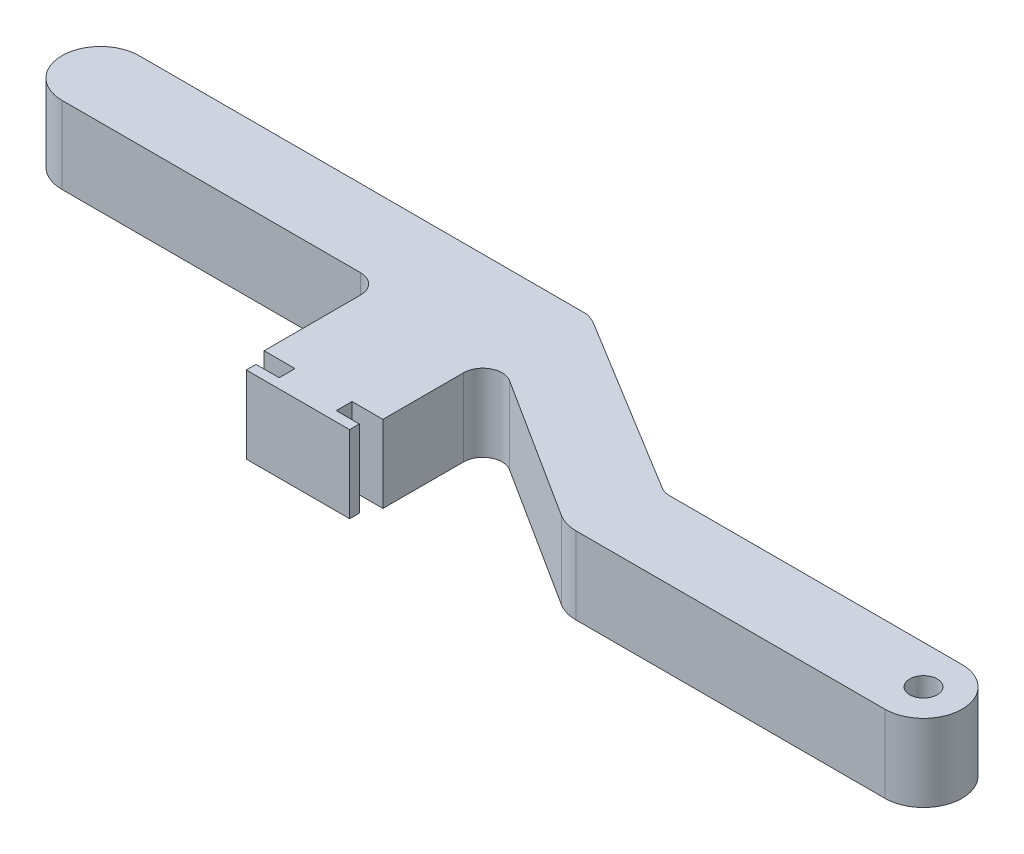
ISO-10303-21;
HEADER;
FILE_DESCRIPTION(('STEP AP214'),'2;1');
FILE_NAME('part.step','',(''),(''),'','','');
FILE_SCHEMA(('AUTOMOTIVE_DESIGN { 1 0 10303 214 1 1 1 1 }'));
ENDSEC;
DATA;
#1=APPLICATION_CONTEXT('core data for automotive mechanical design processes');
#2=APPLICATION_PROTOCOL_DEFINITION('international standard','automotive_design',2000,#1);
#3=PRODUCT_CONTEXT('',#1,'mechanical');
#4=PRODUCT('Part','Part','',(#3));
#5=PRODUCT_RELATED_PRODUCT_CATEGORY('part','',(#4));
#6=PRODUCT_DEFINITION_FORMATION('','',#4);
#7=PRODUCT_DEFINITION_CONTEXT('part definition',#1,'design');
#8=PRODUCT_DEFINITION('design','',#6,#7);
#9=PRODUCT_DEFINITION_SHAPE('','',#8);
#10=(LENGTH_UNIT() NAMED_UNIT(*) SI_UNIT(.MILLI.,.METRE.));
#11=(NAMED_UNIT(*) PLANE_ANGLE_UNIT() SI_UNIT($,.RADIAN.));
#12=(NAMED_UNIT(*) SI_UNIT($,.STERADIAN.) SOLID_ANGLE_UNIT());
#13=UNCERTAINTY_MEASURE_WITH_UNIT(LENGTH_MEASURE(1.E-05),#10,'distance_accuracy_value','');
#14=(GEOMETRIC_REPRESENTATION_CONTEXT(3) GLOBAL_UNCERTAINTY_ASSIGNED_CONTEXT((#13)) GLOBAL_UNIT_ASSIGNED_CONTEXT((#10,
#11,#12)) REPRESENTATION_CONTEXT('',''));
#15=CARTESIAN_POINT('',(0.,0.,0.));
#16=DIRECTION('',(0.,0.,1.));
#17=DIRECTION('',(1.,0.,0.));
#18=AXIS2_PLACEMENT_3D('',#15,#16,#17);
#19=CARTESIAN_POINT('',(-51.2111845281188,6.35,0.567989974414958));
#20=DIRECTION('',(0.,-1.,0.));
#21=DIRECTION('',(0.,0.,-1.));
#22=AXIS2_PLACEMENT_3D('',#19,#20,#21);
#23=PLANE('',#22);
#24=DIRECTION('',(0.,0.,-1.));
#25=VECTOR('',#24,1.);
#26=CARTESIAN_POINT('',(-42.3936845101188,6.35,8.50548997441495));
#27=LINE('',#26,#25);
#28=CARTESIAN_POINT('',(-42.3936845101188,6.35,9.80548997441495));
#29=VERTEX_POINT('',#28);
#30=CARTESIAN_POINT('',(-42.3936845101188,6.35,8.50548997441495));
#31=VERTEX_POINT('',#30);
#32=EDGE_CURVE('E273',#29,#31,#27,.T.);
#33=ORIENTED_EDGE('',*,*,#32,.T.);
#34=DIRECTION('',(1.,0.,0.));
#35=VECTOR('',#34,1.);
#36=CARTESIAN_POINT('',(-39.8536845101188,6.35,8.50548997441495));
#37=LINE('',#36,#35);
#38=CARTESIAN_POINT('',(-39.8536845101188,6.35,8.50548997441495));
#39=VERTEX_POINT('',#38);
#40=EDGE_CURVE('E141',#31,#39,#37,.T.);
#41=ORIENTED_EDGE('',*,*,#40,.T.);
#42=DIRECTION('',(0.,0.,-1.));
#43=VECTOR('',#42,1.);
#44=CARTESIAN_POINT('',(-39.8536845101188,6.35,1.87321426834399));
#45=LINE('',#44,#43);
#46=CARTESIAN_POINT('',(-39.8536845101188,6.35,1.87321426834399));
#47=VERTEX_POINT('',#46);
#48=EDGE_CURVE('E336',#39,#47,#45,.T.);
#49=ORIENTED_EDGE('',*,*,#48,.T.);
#50=CARTESIAN_POINT('',(-38.2661845101188,6.35,1.87321426834396));
#51=DIRECTION('',(0.,-1.,0.));
#52=DIRECTION('',(0.,0.,1.));
#53=AXIS2_PLACEMENT_3D('',#50,#51,#52);
#54=CIRCLE('',#53,1.5875);
#55=CARTESIAN_POINT('',(-37.4135750940826,6.35,0.534105074257622));
#56=VERTEX_POINT('',#55);
#57=EDGE_CURVE('E355',#47,#56,#54,.T.);
#58=ORIENTED_EDGE('',*,*,#57,.T.);
#59=DIRECTION('',(0.843533350605577,0.,0.537076797503046));
#60=VECTOR('',#59,1.);
#61=CARTESIAN_POINT('',(-25.6266784731572,6.35,8.03880976094424));
#62=LINE('',#61,#60);
#63=CARTESIAN_POINT('',(-25.6266784731572,6.35,8.03880976094424));
#64=VERTEX_POINT('',#63);
#65=EDGE_CURVE('E352',#56,#64,#62,.T.);
#66=ORIENTED_EDGE('',*,*,#65,.T.);
#67=CARTESIAN_POINT('',(-23.9696845281188,6.35,5.33048997441495));
#68=DIRECTION('',(0.,1.,0.));
#69=DIRECTION('',(0.,0.,1.));
#70=AXIS2_PLACEMENT_3D('',#67,#68,#69);
#71=CIRCLE('',#70,3.175);
#72=CARTESIAN_POINT('',(-23.9696845281188,6.35,8.50548997441495));
#73=VERTEX_POINT('',#72);
#74=EDGE_CURVE('E354',#64,#73,#71,.T.);
#75=ORIENTED_EDGE('',*,*,#74,.T.);
#76=DIRECTION('',(1.,0.,0.));
#77=VECTOR('',#76,1.);
#78=CARTESIAN_POINT('',(-23.9696845281188,6.35,8.50548997441495));
#79=LINE('',#78,#77);
#80=CARTESIAN_POINT('',(1.43031547188124,6.35,8.50548997441495));
#81=VERTEX_POINT('',#80);
#82=EDGE_CURVE('E357',#73,#81,#79,.T.);
#83=ORIENTED_EDGE('',*,*,#82,.T.);
#84=CARTESIAN_POINT('',(1.43031547188124,6.35,5.33048997441495));
#85=DIRECTION('',(0.,1.,0.));
#86=DIRECTION('',(0.,0.,1.));
#87=AXIS2_PLACEMENT_3D('',#84,#85,#86);
#88=CIRCLE('',#87,3.175);
#89=CARTESIAN_POINT('',(1.43031547188124,6.35,2.15548997441495));
#90=VERTEX_POINT('',#89);
#91=EDGE_CURVE('E363',#81,#90,#88,.T.);
#92=ORIENTED_EDGE('',*,*,#91,.T.);
#93=DIRECTION('',(-1.,0.,0.));
#94=VECTOR('',#93,1.);
#95=CARTESIAN_POINT('',(1.43031547188124,6.35,2.15548997441495));
#96=LINE('',#95,#94);
#97=CARTESIAN_POINT('',(-22.628361270234,6.35,2.15548997441495));
#98=VERTEX_POINT('',#97);
#99=EDGE_CURVE('E365',#90,#98,#96,.T.);
#100=ORIENTED_EDGE('',*,*,#99,.T.);
#101=CARTESIAN_POINT('',(-22.628361270234,6.35,0.56798997441495));
#102=DIRECTION('',(0.,-1.,0.));
#103=DIRECTION('',(0.,0.,1.));
#104=AXIS2_PLACEMENT_3D('',#101,#102,#103);
#105=CIRCLE('',#104,1.5875);
#106=CARTESIAN_POINT('',(-23.4568582427532,6.35,1.9221498676796));
#107=VERTEX_POINT('',#106);
#108=EDGE_CURVE('E367',#98,#107,#105,.T.);
#109=ORIENTED_EDGE('',*,*,#108,.T.);
#110=DIRECTION('',(-0.85301410599348,0.,-0.521887856705006));
#111=VECTOR('',#110,1.);
#112=CARTESIAN_POINT('',(-23.4568582427532,6.35,1.9221498676796));
#113=LINE('',#112,#111);
#114=CARTESIAN_POINT('',(-37.8810914477521,6.35,-6.90282981211434));
#115=VERTEX_POINT('',#114);
#116=EDGE_CURVE('E369',#107,#115,#113,.T.);
#117=ORIENTED_EDGE('',*,*,#116,.T.);
#118=CARTESIAN_POINT('',(-39.6595036132043,6.35,-4.27264442515558));
#119=DIRECTION('',(0.,1.,0.));
#120=DIRECTION('',(0.,0.,1.));
#121=AXIS2_PLACEMENT_3D('',#118,#119,#120);
#122=CIRCLE('',#121,3.17499999999999);
#123=CARTESIAN_POINT('',(-38.9594690048623,6.35,-7.36951002558504));
#124=VERTEX_POINT('',#123);
#125=EDGE_CURVE('E371',#115,#124,#122,.T.);
#126=ORIENTED_EDGE('',*,*,#125,.T.);
#127=DIRECTION('',(-1.,0.,0.));
#128=VECTOR('',#127,1.);
#129=CARTESIAN_POINT('',(-38.9594690048623,6.35,-7.36951002558504));
#130=LINE('',#129,#128);
#131=CARTESIAN_POINT('',(-75.7785681401906,6.35,-7.36951002558503));
#132=VERTEX_POINT('',#131);
#133=EDGE_CURVE('E373',#124,#132,#130,.T.);
#134=ORIENTED_EDGE('',*,*,#133,.T.);
#135=CARTESIAN_POINT('',(-75.7785681401906,6.35,-4.19451002558503));
#136=DIRECTION('',(0.,1.,0.));
#137=DIRECTION('',(0.,0.,1.));
#138=AXIS2_PLACEMENT_3D('',#135,#136,#137);
#139=CIRCLE('',#138,3.175);
#140=CARTESIAN_POINT('',(-75.7785681401906,6.35,-1.01951002558503));
#141=VERTEX_POINT('',#140);
#142=EDGE_CURVE('E375',#132,#141,#139,.T.);
#143=ORIENTED_EDGE('',*,*,#142,.T.);
#144=DIRECTION('',(1.,0.,0.));
#145=VECTOR('',#144,1.);
#146=CARTESIAN_POINT('',(-51.2111845281188,6.35,-1.01951002558504));
#147=LINE('',#146,#145);
#148=CARTESIAN_POINT('',(-51.2111845281188,6.35,-1.01951002558504));
#149=VERTEX_POINT('',#148);
#150=EDGE_CURVE('E377',#141,#149,#147,.T.);
#151=ORIENTED_EDGE('',*,*,#150,.T.);
#152=CARTESIAN_POINT('',(-51.2111845281188,6.35,0.567989974414958));
#153=DIRECTION('',(0.,-1.,0.));
#154=DIRECTION('',(0.,0.,-1.));
#155=AXIS2_PLACEMENT_3D('',#152,#153,#154);
#156=CIRCLE('',#155,1.5875);
#157=CARTESIAN_POINT('',(-49.6236845281188,6.35,0.567989974414969));
#158=VERTEX_POINT('',#157);
#159=EDGE_CURVE('E379',#149,#158,#156,.T.);
#160=ORIENTED_EDGE('',*,*,#159,.T.);
#161=DIRECTION('',(0.,0.,1.));
#162=VECTOR('',#161,1.);
#163=CARTESIAN_POINT('',(-49.6236845281188,6.35,0.567989974414969));
#164=LINE('',#163,#162);
#165=CARTESIAN_POINT('',(-49.6236845281188,6.35,8.50548997441495));
#166=VERTEX_POINT('',#165);
#167=EDGE_CURVE('E381',#158,#166,#164,.T.);
#168=ORIENTED_EDGE('',*,*,#167,.T.);
#169=DIRECTION('',(1.,0.,0.));
#170=VECTOR('',#169,1.);
#171=CARTESIAN_POINT('',(-47.0836845281188,6.35,8.50548997441495));
#172=LINE('',#171,#170);
#173=CARTESIAN_POINT('',(-47.0836845281188,6.35,8.50548997441495));
#174=VERTEX_POINT('',#173);
#175=EDGE_CURVE('E383',#166,#174,#172,.T.);
#176=ORIENTED_EDGE('',*,*,#175,.T.);
#177=DIRECTION('',(0.,0.,1.));
#178=VECTOR('',#177,1.);
#179=CARTESIAN_POINT('',(-47.0836845281188,6.35,8.50548997441495));
#180=LINE('',#179,#178);
#181=CARTESIAN_POINT('',(-47.0836845281188,6.35,9.80548997441495));
#182=VERTEX_POINT('',#181);
#183=EDGE_CURVE('E385',#174,#182,#180,.T.);
#184=ORIENTED_EDGE('',*,*,#183,.T.);
#185=DIRECTION('',(-1.,0.,0.));
#186=VECTOR('',#185,1.);
#187=CARTESIAN_POINT('',(-47.0836845281188,6.35,9.80548997441495));
#188=LINE('',#187,#186);
#189=CARTESIAN_POINT('',(-48.9886845281188,6.35,9.80548997441495));
#190=VERTEX_POINT('',#189);
#191=EDGE_CURVE('E387',#182,#190,#188,.T.);
#192=ORIENTED_EDGE('',*,*,#191,.T.);
#193=DIRECTION('',(0.,0.,1.));
#194=VECTOR('',#193,1.);
#195=CARTESIAN_POINT('',(-48.9886845281188,6.35,9.80548997441495));
#196=LINE('',#195,#194);
#197=CARTESIAN_POINT('',(-48.9886845281188,6.35,10.6054899744149));
#198=VERTEX_POINT('',#197);
#199=EDGE_CURVE('E208',#190,#198,#196,.T.);
#200=ORIENTED_EDGE('',*,*,#199,.T.);
#201=DIRECTION('',(1.,0.,0.));
#202=VECTOR('',#201,1.);
#203=CARTESIAN_POINT('',(-40.4886845101188,6.35,10.6054899744149));
#204=LINE('',#203,#202);
#205=CARTESIAN_POINT('',(-40.4886845101188,6.35,10.6054899744149));
#206=VERTEX_POINT('',#205);
#207=EDGE_CURVE('E202',#198,#206,#204,.T.);
#208=ORIENTED_EDGE('',*,*,#207,.T.);
#209=DIRECTION('',(0.,0.,-1.));
#210=VECTOR('',#209,1.);
#211=CARTESIAN_POINT('',(-40.4886845101188,6.35,9.80548997441495));
#212=LINE('',#211,#210);
#213=CARTESIAN_POINT('',(-40.4886845101188,6.35,9.80548997441495));
#214=VERTEX_POINT('',#213);
#215=EDGE_CURVE('E206',#206,#214,#212,.T.);
#216=ORIENTED_EDGE('',*,*,#215,.T.);
#217=DIRECTION('',(-1.,0.,0.));
#218=VECTOR('',#217,1.);
#219=CARTESIAN_POINT('',(-40.4886845101188,6.35,9.80548997441495));
#220=LINE('',#219,#218);
#221=EDGE_CURVE('E50',#214,#29,#220,.T.);
#222=ORIENTED_EDGE('',*,*,#221,.T.);
#223=EDGE_LOOP('',(#33,#41,#49,#58,#66,#75,#83,#92,#100,#109,#117,#126,#134,#143,#151,#160,#168,
#176,#184,#192,#200,#208,#216,#222));
#224=FACE_BOUND('',#223,.T.);
#225=CARTESIAN_POINT('',(1.43031547188124,6.35,5.33048997441495));
#226=DIRECTION('',(0.,1.,0.));
#227=DIRECTION('',(0.,0.,1.));
#228=AXIS2_PLACEMENT_3D('',#225,#226,#227);
#229=CIRCLE('',#228,1.1303);
#230=CARTESIAN_POINT('',(1.43031547188124,6.35,6.46078997441495));
#231=VERTEX_POINT('',#230);
#232=EDGE_CURVE('E230',#231,#231,#229,.T.);
#233=ORIENTED_EDGE('',*,*,#232,.F.);
#234=EDGE_LOOP('',(#233));
#235=FACE_BOUND('',#234,.T.);
#236=ADVANCED_FACE('F33',(#224,#235),#23,.F.);
#237=CARTESIAN_POINT('',(-51.2111845281188,0.,0.567989974414958));
#238=DIRECTION('',(0.,-1.,0.));
#239=DIRECTION('',(0.,0.,-1.));
#240=AXIS2_PLACEMENT_3D('',#237,#238,#239);
#241=PLANE('',#240);
#242=DIRECTION('',(0.,0.,-1.));
#243=VECTOR('',#242,1.);
#244=CARTESIAN_POINT('',(-42.3936845101188,0.,8.50548997441495));
#245=LINE('',#244,#243);
#246=CARTESIAN_POINT('',(-42.3936845101188,0.,9.80548997441495));
#247=VERTEX_POINT('',#246);
#248=CARTESIAN_POINT('',(-42.3936845101188,0.,8.50548997441495));
#249=VERTEX_POINT('',#248);
#250=EDGE_CURVE('E226',#247,#249,#245,.T.);
#251=ORIENTED_EDGE('',*,*,#250,.F.);
#252=DIRECTION('',(-1.,0.,0.));
#253=VECTOR('',#252,1.);
#254=CARTESIAN_POINT('',(-40.4886845101188,0.,9.80548997441495));
#255=LINE('',#254,#253);
#256=CARTESIAN_POINT('',(-40.4886845101188,0.,9.80548997441495));
#257=VERTEX_POINT('',#256);
#258=EDGE_CURVE('E133',#257,#247,#255,.T.);
#259=ORIENTED_EDGE('',*,*,#258,.F.);
#260=DIRECTION('',(0.,0.,-1.));
#261=VECTOR('',#260,1.);
#262=CARTESIAN_POINT('',(-40.4886845101188,0.,9.80548997441495));
#263=LINE('',#262,#261);
#264=CARTESIAN_POINT('',(-40.4886845101188,0.,10.6054899744149));
#265=VERTEX_POINT('',#264);
#266=EDGE_CURVE('E127',#265,#257,#263,.T.);
#267=ORIENTED_EDGE('',*,*,#266,.F.);
#268=DIRECTION('',(1.,0.,0.));
#269=VECTOR('',#268,1.);
#270=CARTESIAN_POINT('',(-40.4886845101188,0.,10.6054899744149));
#271=LINE('',#270,#269);
#272=CARTESIAN_POINT('',(-48.9886845281188,0.,10.6054899744149));
#273=VERTEX_POINT('',#272);
#274=EDGE_CURVE('E216',#273,#265,#271,.T.);
#275=ORIENTED_EDGE('',*,*,#274,.F.);
#276=DIRECTION('',(0.,0.,1.));
#277=VECTOR('',#276,1.);
#278=CARTESIAN_POINT('',(-48.9886845281188,0.,9.80548997441495));
#279=LINE('',#278,#277);
#280=CARTESIAN_POINT('',(-48.9886845281188,0.,9.80548997441495));
#281=VERTEX_POINT('',#280);
#282=EDGE_CURVE('E268',#281,#273,#279,.T.);
#283=ORIENTED_EDGE('',*,*,#282,.F.);
#284=DIRECTION('',(-1.,0.,0.));
#285=VECTOR('',#284,1.);
#286=CARTESIAN_POINT('',(-47.0836845281188,0.,9.80548997441495));
#287=LINE('',#286,#285);
#288=CARTESIAN_POINT('',(-47.0836845281188,0.,9.80548997441495));
#289=VERTEX_POINT('',#288);
#290=EDGE_CURVE('E266',#289,#281,#287,.T.);
#291=ORIENTED_EDGE('',*,*,#290,.F.);
#292=DIRECTION('',(0.,0.,1.));
#293=VECTOR('',#292,1.);
#294=CARTESIAN_POINT('',(-47.0836845281188,0.,8.50548997441495));
#295=LINE('',#294,#293);
#296=CARTESIAN_POINT('',(-47.0836845281188,0.,8.50548997441495));
#297=VERTEX_POINT('',#296);
#298=EDGE_CURVE('E264',#297,#289,#295,.T.);
#299=ORIENTED_EDGE('',*,*,#298,.F.);
#300=DIRECTION('',(1.,0.,0.));
#301=VECTOR('',#300,1.);
#302=CARTESIAN_POINT('',(-47.0836845281188,0.,8.50548997441495));
#303=LINE('',#302,#301);
#304=CARTESIAN_POINT('',(-49.6236845281188,0.,8.50548997441495));
#305=VERTEX_POINT('',#304);
#306=EDGE_CURVE('E262',#305,#297,#303,.T.);
#307=ORIENTED_EDGE('',*,*,#306,.F.);
#308=DIRECTION('',(0.,0.,1.));
#309=VECTOR('',#308,1.);
#310=CARTESIAN_POINT('',(-49.6236845281188,0.,0.567989974414969));
#311=LINE('',#310,#309);
#312=CARTESIAN_POINT('',(-49.6236845281188,0.,0.567989974414969));
#313=VERTEX_POINT('',#312);
#314=EDGE_CURVE('E260',#313,#305,#311,.T.);
#315=ORIENTED_EDGE('',*,*,#314,.F.);
#316=CARTESIAN_POINT('',(-51.2111845281188,0.,0.567989974414958));
#317=DIRECTION('',(0.,-1.,0.));
#318=DIRECTION('',(0.,0.,-1.));
#319=AXIS2_PLACEMENT_3D('',#316,#317,#318);
#320=CIRCLE('',#319,1.5875);
#321=CARTESIAN_POINT('',(-51.2111845281188,0.,-1.01951002558504));
#322=VERTEX_POINT('',#321);
#323=EDGE_CURVE('E258',#322,#313,#320,.T.);
#324=ORIENTED_EDGE('',*,*,#323,.F.);
#325=DIRECTION('',(1.,0.,0.));
#326=VECTOR('',#325,1.);
#327=CARTESIAN_POINT('',(-51.2111845281188,0.,-1.01951002558504));
#328=LINE('',#327,#326);
#329=CARTESIAN_POINT('',(-75.7785681401906,0.,-1.01951002558503));
#330=VERTEX_POINT('',#329);
#331=EDGE_CURVE('E256',#330,#322,#328,.T.);
#332=ORIENTED_EDGE('',*,*,#331,.F.);
#333=CARTESIAN_POINT('',(-75.7785681401906,0.,-4.19451002558503));
#334=DIRECTION('',(0.,1.,0.));
#335=DIRECTION('',(0.,0.,1.));
#336=AXIS2_PLACEMENT_3D('',#333,#334,#335);
#337=CIRCLE('',#336,3.175);
#338=CARTESIAN_POINT('',(-75.7785681401906,0.,-7.36951002558503));
#339=VERTEX_POINT('',#338);
#340=EDGE_CURVE('E254',#339,#330,#337,.T.);
#341=ORIENTED_EDGE('',*,*,#340,.F.);
#342=DIRECTION('',(-1.,0.,0.));
#343=VECTOR('',#342,1.);
#344=CARTESIAN_POINT('',(-38.9594690048623,0.,-7.36951002558504));
#345=LINE('',#344,#343);
#346=CARTESIAN_POINT('',(-38.9594690048623,0.,-7.36951002558504));
#347=VERTEX_POINT('',#346);
#348=EDGE_CURVE('E252',#347,#339,#345,.T.);
#349=ORIENTED_EDGE('',*,*,#348,.F.);
#350=CARTESIAN_POINT('',(-39.6595036132043,0.,-4.27264442515558));
#351=DIRECTION('',(0.,1.,0.));
#352=DIRECTION('',(0.,0.,1.));
#353=AXIS2_PLACEMENT_3D('',#350,#351,#352);
#354=CIRCLE('',#353,3.17499999999999);
#355=CARTESIAN_POINT('',(-37.8810914477521,0.,-6.90282981211434));
#356=VERTEX_POINT('',#355);
#357=EDGE_CURVE('E250',#356,#347,#354,.T.);
#358=ORIENTED_EDGE('',*,*,#357,.F.);
#359=DIRECTION('',(-0.85301410599348,0.,-0.521887856705006));
#360=VECTOR('',#359,1.);
#361=CARTESIAN_POINT('',(-23.4568582427532,0.,1.9221498676796));
#362=LINE('',#361,#360);
#363=CARTESIAN_POINT('',(-23.4568582427532,0.,1.9221498676796));
#364=VERTEX_POINT('',#363);
#365=EDGE_CURVE('E248',#364,#356,#362,.T.);
#366=ORIENTED_EDGE('',*,*,#365,.F.);
#367=CARTESIAN_POINT('',(-22.628361270234,0.,0.56798997441495));
#368=DIRECTION('',(0.,-1.,0.));
#369=DIRECTION('',(0.,0.,1.));
#370=AXIS2_PLACEMENT_3D('',#367,#368,#369);
#371=CIRCLE('',#370,1.5875);
#372=CARTESIAN_POINT('',(-22.628361270234,0.,2.15548997441495));
#373=VERTEX_POINT('',#372);
#374=EDGE_CURVE('E246',#373,#364,#371,.T.);
#375=ORIENTED_EDGE('',*,*,#374,.F.);
#376=DIRECTION('',(-1.,0.,0.));
#377=VECTOR('',#376,1.);
#378=CARTESIAN_POINT('',(1.43031547188124,0.,2.15548997441495));
#379=LINE('',#378,#377);
#380=CARTESIAN_POINT('',(1.43031547188124,0.,2.15548997441495));
#381=VERTEX_POINT('',#380);
#382=EDGE_CURVE('E244',#381,#373,#379,.T.);
#383=ORIENTED_EDGE('',*,*,#382,.F.);
#384=CARTESIAN_POINT('',(1.43031547188124,0.,5.33048997441495));
#385=DIRECTION('',(0.,1.,0.));
#386=DIRECTION('',(0.,0.,1.));
#387=AXIS2_PLACEMENT_3D('',#384,#385,#386);
#388=CIRCLE('',#387,3.175);
#389=CARTESIAN_POINT('',(1.43031547188124,0.,8.50548997441495));
#390=VERTEX_POINT('',#389);
#391=EDGE_CURVE('E242',#390,#381,#388,.T.);
#392=ORIENTED_EDGE('',*,*,#391,.F.);
#393=DIRECTION('',(1.,0.,0.));
#394=VECTOR('',#393,1.);
#395=CARTESIAN_POINT('',(-23.9696845281188,0.,8.50548997441495));
#396=LINE('',#395,#394);
#397=CARTESIAN_POINT('',(-23.9696845281188,0.,8.50548997441495));
#398=VERTEX_POINT('',#397);
#399=EDGE_CURVE('E240',#398,#390,#396,.T.);
#400=ORIENTED_EDGE('',*,*,#399,.F.);
#401=CARTESIAN_POINT('',(-23.9696845281188,0.,5.33048997441495));
#402=DIRECTION('',(0.,1.,0.));
#403=DIRECTION('',(0.,0.,1.));
#404=AXIS2_PLACEMENT_3D('',#401,#402,#403);
#405=CIRCLE('',#404,3.175);
#406=CARTESIAN_POINT('',(-25.6266784731572,0.,8.03880976094424));
#407=VERTEX_POINT('',#406);
#408=EDGE_CURVE('E238',#407,#398,#405,.T.);
#409=ORIENTED_EDGE('',*,*,#408,.F.);
#410=DIRECTION('',(0.843533350605577,0.,0.537076797503046));
#411=VECTOR('',#410,1.);
#412=CARTESIAN_POINT('',(-25.6266784731572,0.,8.03880976094424));
#413=LINE('',#412,#411);
#414=CARTESIAN_POINT('',(-37.4135750940826,0.,0.534105074257622));
#415=VERTEX_POINT('',#414);
#416=EDGE_CURVE('E236',#415,#407,#413,.T.);
#417=ORIENTED_EDGE('',*,*,#416,.F.);
#418=CARTESIAN_POINT('',(-38.2661845101188,0.,1.87321426834396));
#419=DIRECTION('',(0.,-1.,0.));
#420=DIRECTION('',(0.,0.,1.));
#421=AXIS2_PLACEMENT_3D('',#418,#419,#420);
#422=CIRCLE('',#421,1.5875);
#423=CARTESIAN_POINT('',(-39.8536845101188,0.,1.87321426834399));
#424=VERTEX_POINT('',#423);
#425=EDGE_CURVE('E234',#424,#415,#422,.T.);
#426=ORIENTED_EDGE('',*,*,#425,.F.);
#427=DIRECTION('',(0.,0.,-1.));
#428=VECTOR('',#427,1.);
#429=CARTESIAN_POINT('',(-39.8536845101188,0.,1.87321426834399));
#430=LINE('',#429,#428);
#431=CARTESIAN_POINT('',(-39.8536845101188,0.,8.50548997441495));
#432=VERTEX_POINT('',#431);
#433=EDGE_CURVE('E232',#432,#424,#430,.T.);
#434=ORIENTED_EDGE('',*,*,#433,.F.);
#435=DIRECTION('',(1.,0.,0.));
#436=VECTOR('',#435,1.);
#437=CARTESIAN_POINT('',(-39.8536845101188,0.,8.50548997441495));
#438=LINE('',#437,#436);
#439=EDGE_CURVE('E229',#249,#432,#438,.T.);
#440=ORIENTED_EDGE('',*,*,#439,.F.);
#441=EDGE_LOOP('',(#251,#259,#267,#275,#283,#291,#299,#307,#315,#324,#332,#341,#349,#358,#366,
#375,#383,#392,#400,#409,#417,#426,#434,#440));
#442=FACE_BOUND('',#441,.T.);
#443=CARTESIAN_POINT('',(1.43031547188124,0.,5.33048997441495));
#444=DIRECTION('',(0.,1.,0.));
#445=DIRECTION('',(0.,0.,1.));
#446=AXIS2_PLACEMENT_3D('',#443,#444,#445);
#447=CIRCLE('',#446,1.1303);
#448=CARTESIAN_POINT('',(1.43031547188124,0.,6.46078997441495));
#449=VERTEX_POINT('',#448);
#450=EDGE_CURVE('E690',#449,#449,#447,.T.);
#451=ORIENTED_EDGE('',*,*,#450,.T.);
#452=EDGE_LOOP('',(#451));
#453=FACE_BOUND('',#452,.T.);
#454=ADVANCED_FACE('F340',(#442,#453),#241,.T.);
#455=CARTESIAN_POINT('',(-42.3936845101188,6.35,8.50548997441495));
#456=DIRECTION('',(-1.,0.,0.));
#457=DIRECTION('',(0.,0.,1.));
#458=AXIS2_PLACEMENT_3D('',#455,#456,#457);
#459=PLANE('',#458);
#460=ORIENTED_EDGE('',*,*,#250,.T.);
#461=DIRECTION('',(0.,-1.,0.));
#462=VECTOR('',#461,1.);
#463=CARTESIAN_POINT('',(-42.3936845101188,6.35,8.50548997441495));
#464=LINE('',#463,#462);
#465=EDGE_CURVE('E11',#31,#249,#464,.T.);
#466=ORIENTED_EDGE('',*,*,#465,.F.);
#467=ORIENTED_EDGE('',*,*,#32,.F.);
#468=DIRECTION('',(0.,-1.,0.));
#469=VECTOR('',#468,1.);
#470=CARTESIAN_POINT('',(-42.3936845101188,6.35,9.80548997441495));
#471=LINE('',#470,#469);
#472=EDGE_CURVE('E222',#29,#247,#471,.T.);
#473=ORIENTED_EDGE('',*,*,#472,.T.);
#474=EDGE_LOOP('',(#460,#466,#467,#473));
#475=FACE_BOUND('',#474,.T.);
#476=ADVANCED_FACE('F35',(#475),#459,.F.);
#477=CARTESIAN_POINT('',(-39.8536845101188,6.35,8.50548997441495));
#478=DIRECTION('',(0.,0.,-1.));
#479=DIRECTION('',(-1.,0.,0.));
#480=AXIS2_PLACEMENT_3D('',#477,#478,#479);
#481=PLANE('',#480);
#482=ORIENTED_EDGE('',*,*,#439,.T.);
#483=DIRECTION('',(0.,-1.,0.));
#484=VECTOR('',#483,1.);
#485=CARTESIAN_POINT('',(-39.8536845101188,6.35,8.50548997441495));
#486=LINE('',#485,#484);
#487=EDGE_CURVE('E42',#39,#432,#486,.T.);
#488=ORIENTED_EDGE('',*,*,#487,.F.);
#489=ORIENTED_EDGE('',*,*,#40,.F.);
#490=ORIENTED_EDGE('',*,*,#465,.T.);
#491=EDGE_LOOP('',(#482,#488,#489,#490));
#492=FACE_BOUND('',#491,.T.);
#493=ADVANCED_FACE('F421',(#492),#481,.F.);
#494=CARTESIAN_POINT('',(-39.8536845101188,6.35,1.87321426834399));
#495=DIRECTION('',(-1.,0.,0.));
#496=DIRECTION('',(0.,0.,1.));
#497=AXIS2_PLACEMENT_3D('',#494,#495,#496);
#498=PLANE('',#497);
#499=ORIENTED_EDGE('',*,*,#433,.T.);
#500=DIRECTION('',(0.,-1.,0.));
#501=VECTOR('',#500,1.);
#502=CARTESIAN_POINT('',(-39.8536845101188,6.35,1.87321426834399));
#503=LINE('',#502,#501);
#504=EDGE_CURVE('E328',#47,#424,#503,.T.);
#505=ORIENTED_EDGE('',*,*,#504,.F.);
#506=ORIENTED_EDGE('',*,*,#48,.F.);
#507=ORIENTED_EDGE('',*,*,#487,.T.);
#508=EDGE_LOOP('',(#499,#505,#506,#507));
#509=FACE_BOUND('',#508,.T.);
#510=ADVANCED_FACE('F334',(#509),#498,.F.);
#511=CARTESIAN_POINT('',(-38.2661845101188,6.35,1.87321426834396));
#512=DIRECTION('',(0.,-1.,0.));
#513=DIRECTION('',(0.,0.,-1.));
#514=AXIS2_PLACEMENT_3D('',#511,#512,#513);
#515=CYLINDRICAL_SURFACE('',#514,1.5875);
#516=ORIENTED_EDGE('',*,*,#425,.T.);
#517=DIRECTION('',(0.,-1.,0.));
#518=VECTOR('',#517,1.);
#519=CARTESIAN_POINT('',(-37.4135750940826,6.35,0.534105074257622));
#520=LINE('',#519,#518);
#521=EDGE_CURVE('E325',#56,#415,#520,.T.);
#522=ORIENTED_EDGE('',*,*,#521,.F.);
#523=ORIENTED_EDGE('',*,*,#57,.F.);
#524=ORIENTED_EDGE('',*,*,#504,.T.);
#525=EDGE_LOOP('',(#516,#522,#523,#524));
#526=FACE_BOUND('',#525,.T.);
#527=ADVANCED_FACE('F346',(#526),#515,.F.);
#528=CARTESIAN_POINT('',(-25.6266784731572,6.35,8.03880976094424));
#529=DIRECTION('',(0.537076797503046,0.,-0.843533350605577));
#530=DIRECTION('',(-0.843533350605577,0.,-0.537076797503046));
#531=AXIS2_PLACEMENT_3D('',#528,#529,#530);
#532=PLANE('',#531);
#533=ORIENTED_EDGE('',*,*,#416,.T.);
#534=DIRECTION('',(0.,-1.,0.));
#535=VECTOR('',#534,1.);
#536=CARTESIAN_POINT('',(-25.6266784731572,6.35,8.03880976094424));
#537=LINE('',#536,#535);
#538=EDGE_CURVE('E322',#64,#407,#537,.T.);
#539=ORIENTED_EDGE('',*,*,#538,.F.);
#540=ORIENTED_EDGE('',*,*,#65,.F.);
#541=ORIENTED_EDGE('',*,*,#521,.T.);
#542=EDGE_LOOP('',(#533,#539,#540,#541));
#543=FACE_BOUND('',#542,.T.);
#544=ADVANCED_FACE('F350',(#543),#532,.F.);
#545=CARTESIAN_POINT('',(-23.9696845281188,6.35,5.33048997441495));
#546=DIRECTION('',(0.,-1.,0.));
#547=DIRECTION('',(0.,0.,-1.));
#548=AXIS2_PLACEMENT_3D('',#545,#546,#547);
#549=CYLINDRICAL_SURFACE('',#548,3.175);
#550=ORIENTED_EDGE('',*,*,#408,.T.);
#551=DIRECTION('',(0.,-1.,0.));
#552=VECTOR('',#551,1.);
#553=CARTESIAN_POINT('',(-23.9696845281188,6.35,8.50548997441495));
#554=LINE('',#553,#552);
#555=EDGE_CURVE('E319',#73,#398,#554,.T.);
#556=ORIENTED_EDGE('',*,*,#555,.F.);
#557=ORIENTED_EDGE('',*,*,#74,.F.);
#558=ORIENTED_EDGE('',*,*,#538,.T.);
#559=EDGE_LOOP('',(#550,#556,#557,#558));
#560=FACE_BOUND('',#559,.T.);
#561=ADVANCED_FACE('F434',(#560),#549,.T.);
#562=CARTESIAN_POINT('',(-23.9696845281188,6.35,8.50548997441495));
#563=DIRECTION('',(0.,0.,-1.));
#564=DIRECTION('',(-1.,0.,0.));
#565=AXIS2_PLACEMENT_3D('',#562,#563,#564);
#566=PLANE('',#565);
#567=ORIENTED_EDGE('',*,*,#399,.T.);
#568=DIRECTION('',(0.,-1.,0.));
#569=VECTOR('',#568,1.);
#570=CARTESIAN_POINT('',(1.43031547188124,6.35,8.50548997441495));
#571=LINE('',#570,#569);
#572=EDGE_CURVE('E316',#81,#390,#571,.T.);
#573=ORIENTED_EDGE('',*,*,#572,.F.);
#574=ORIENTED_EDGE('',*,*,#82,.F.);
#575=ORIENTED_EDGE('',*,*,#555,.T.);
#576=EDGE_LOOP('',(#567,#573,#574,#575));
#577=FACE_BOUND('',#576,.T.);
#578=ADVANCED_FACE('F437',(#577),#566,.F.);
#579=CARTESIAN_POINT('',(1.43031547188124,6.35,5.33048997441495));
#580=DIRECTION('',(0.,-1.,0.));
#581=DIRECTION('',(0.,0.,-1.));
#582=AXIS2_PLACEMENT_3D('',#579,#580,#581);
#583=CYLINDRICAL_SURFACE('',#582,3.175);
#584=ORIENTED_EDGE('',*,*,#391,.T.);
#585=DIRECTION('',(0.,-1.,0.));
#586=VECTOR('',#585,1.);
#587=CARTESIAN_POINT('',(1.43031547188124,6.35,2.15548997441495));
#588=LINE('',#587,#586);
#589=EDGE_CURVE('E313',#90,#381,#588,.T.);
#590=ORIENTED_EDGE('',*,*,#589,.F.);
#591=ORIENTED_EDGE('',*,*,#91,.F.);
#592=ORIENTED_EDGE('',*,*,#572,.T.);
#593=EDGE_LOOP('',(#584,#590,#591,#592));
#594=FACE_BOUND('',#593,.T.);
#595=ADVANCED_FACE('F441',(#594),#583,.T.);
#596=CARTESIAN_POINT('',(1.43031547188124,6.35,2.15548997441495));
#597=DIRECTION('',(0.,0.,1.));
#598=DIRECTION('',(1.,0.,0.));
#599=AXIS2_PLACEMENT_3D('',#596,#597,#598);
#600=PLANE('',#599);
#601=ORIENTED_EDGE('',*,*,#382,.T.);
#602=DIRECTION('',(0.,-1.,0.));
#603=VECTOR('',#602,1.);
#604=CARTESIAN_POINT('',(-22.628361270234,6.35,2.15548997441495));
#605=LINE('',#604,#603);
#606=EDGE_CURVE('E310',#98,#373,#605,.T.);
#607=ORIENTED_EDGE('',*,*,#606,.F.);
#608=ORIENTED_EDGE('',*,*,#99,.F.);
#609=ORIENTED_EDGE('',*,*,#589,.T.);
#610=EDGE_LOOP('',(#601,#607,#608,#609));
#611=FACE_BOUND('',#610,.T.);
#612=ADVANCED_FACE('F445',(#611),#600,.F.);
#613=CARTESIAN_POINT('',(-22.628361270234,6.35,0.56798997441495));
#614=DIRECTION('',(0.,-1.,0.));
#615=DIRECTION('',(0.,0.,-1.));
#616=AXIS2_PLACEMENT_3D('',#613,#614,#615);
#617=CYLINDRICAL_SURFACE('',#616,1.5875);
#618=ORIENTED_EDGE('',*,*,#374,.T.);
#619=DIRECTION('',(0.,-1.,0.));
#620=VECTOR('',#619,1.);
#621=CARTESIAN_POINT('',(-23.4568582427532,6.35,1.9221498676796));
#622=LINE('',#621,#620);
#623=EDGE_CURVE('E307',#107,#364,#622,.T.);
#624=ORIENTED_EDGE('',*,*,#623,.F.);
#625=ORIENTED_EDGE('',*,*,#108,.F.);
#626=ORIENTED_EDGE('',*,*,#606,.T.);
#627=EDGE_LOOP('',(#618,#624,#625,#626));
#628=FACE_BOUND('',#627,.T.);
#629=ADVANCED_FACE('F449',(#628),#617,.F.);
#630=CARTESIAN_POINT('',(-23.4568582427532,6.35,1.9221498676796));
#631=DIRECTION('',(-0.521887856705006,0.,0.853014105993479));
#632=DIRECTION('',(0.853014105993479,0.,0.521887856705006));
#633=AXIS2_PLACEMENT_3D('',#630,#631,#632);
#634=PLANE('',#633);
#635=ORIENTED_EDGE('',*,*,#365,.T.);
#636=DIRECTION('',(0.,-1.,0.));
#637=VECTOR('',#636,1.);
#638=CARTESIAN_POINT('',(-37.8810914477521,6.35,-6.90282981211434));
#639=LINE('',#638,#637);
#640=EDGE_CURVE('E304',#115,#356,#639,.T.);
#641=ORIENTED_EDGE('',*,*,#640,.F.);
#642=ORIENTED_EDGE('',*,*,#116,.F.);
#643=ORIENTED_EDGE('',*,*,#623,.T.);
#644=EDGE_LOOP('',(#635,#641,#642,#643));
#645=FACE_BOUND('',#644,.T.);
#646=ADVANCED_FACE('F453',(#645),#634,.F.);
#647=CARTESIAN_POINT('',(-39.6595036132043,6.35,-4.27264442515558));
#648=DIRECTION('',(0.,-1.,0.));
#649=DIRECTION('',(0.,0.,-1.));
#650=AXIS2_PLACEMENT_3D('',#647,#648,#649);
#651=CYLINDRICAL_SURFACE('',#650,3.17499999999999);
#652=ORIENTED_EDGE('',*,*,#357,.T.);
#653=DIRECTION('',(0.,-1.,0.));
#654=VECTOR('',#653,1.);
#655=CARTESIAN_POINT('',(-38.9594690048623,6.35,-7.36951002558504));
#656=LINE('',#655,#654);
#657=EDGE_CURVE('E301',#124,#347,#656,.T.);
#658=ORIENTED_EDGE('',*,*,#657,.F.);
#659=ORIENTED_EDGE('',*,*,#125,.F.);
#660=ORIENTED_EDGE('',*,*,#640,.T.);
#661=EDGE_LOOP('',(#652,#658,#659,#660));
#662=FACE_BOUND('',#661,.T.);
#663=ADVANCED_FACE('F457',(#662),#651,.T.);
#664=CARTESIAN_POINT('',(-38.9594690048623,6.35,-7.36951002558504));
#665=DIRECTION('',(0.,0.,1.));
#666=DIRECTION('',(1.,0.,0.));
#667=AXIS2_PLACEMENT_3D('',#664,#665,#666);
#668=PLANE('',#667);
#669=ORIENTED_EDGE('',*,*,#348,.T.);
#670=DIRECTION('',(0.,-1.,0.));
#671=VECTOR('',#670,1.);
#672=CARTESIAN_POINT('',(-75.7785681401906,6.35,-7.36951002558503));
#673=LINE('',#672,#671);
#674=EDGE_CURVE('E298',#132,#339,#673,.T.);
#675=ORIENTED_EDGE('',*,*,#674,.F.);
#676=ORIENTED_EDGE('',*,*,#133,.F.);
#677=ORIENTED_EDGE('',*,*,#657,.T.);
#678=EDGE_LOOP('',(#669,#675,#676,#677));
#679=FACE_BOUND('',#678,.T.);
#680=ADVANCED_FACE('F461',(#679),#668,.F.);
#681=CARTESIAN_POINT('',(-75.7785681401906,6.35,-4.19451002558503));
#682=DIRECTION('',(0.,-1.,0.));
#683=DIRECTION('',(0.,0.,-1.));
#684=AXIS2_PLACEMENT_3D('',#681,#682,#683);
#685=CYLINDRICAL_SURFACE('',#684,3.175);
#686=ORIENTED_EDGE('',*,*,#340,.T.);
#687=DIRECTION('',(0.,-1.,0.));
#688=VECTOR('',#687,1.);
#689=CARTESIAN_POINT('',(-75.7785681401906,6.35,-1.01951002558503));
#690=LINE('',#689,#688);
#691=EDGE_CURVE('E295',#141,#330,#690,.T.);
#692=ORIENTED_EDGE('',*,*,#691,.F.);
#693=ORIENTED_EDGE('',*,*,#142,.F.);
#694=ORIENTED_EDGE('',*,*,#674,.T.);
#695=EDGE_LOOP('',(#686,#692,#693,#694));
#696=FACE_BOUND('',#695,.T.);
#697=ADVANCED_FACE('F465',(#696),#685,.T.);
#698=CARTESIAN_POINT('',(-51.2111845281188,6.35,-1.01951002558504));
#699=DIRECTION('',(0.,0.,-1.));
#700=DIRECTION('',(-1.,0.,0.));
#701=AXIS2_PLACEMENT_3D('',#698,#699,#700);
#702=PLANE('',#701);
#703=ORIENTED_EDGE('',*,*,#331,.T.);
#704=DIRECTION('',(0.,-1.,0.));
#705=VECTOR('',#704,1.);
#706=CARTESIAN_POINT('',(-51.2111845281188,6.35,-1.01951002558504));
#707=LINE('',#706,#705);
#708=EDGE_CURVE('E292',#149,#322,#707,.T.);
#709=ORIENTED_EDGE('',*,*,#708,.F.);
#710=ORIENTED_EDGE('',*,*,#150,.F.);
#711=ORIENTED_EDGE('',*,*,#691,.T.);
#712=EDGE_LOOP('',(#703,#709,#710,#711));
#713=FACE_BOUND('',#712,.T.);
#714=ADVANCED_FACE('F469',(#713),#702,.F.);
#715=CARTESIAN_POINT('',(-51.2111845281188,6.35,0.567989974414958));
#716=DIRECTION('',(0.,-1.,0.));
#717=DIRECTION('',(0.,0.,-1.));
#718=AXIS2_PLACEMENT_3D('',#715,#716,#717);
#719=CYLINDRICAL_SURFACE('',#718,1.5875);
#720=ORIENTED_EDGE('',*,*,#323,.T.);
#721=DIRECTION('',(0.,-1.,0.));
#722=VECTOR('',#721,1.);
#723=CARTESIAN_POINT('',(-49.6236845281188,6.35,0.567989974414969));
#724=LINE('',#723,#722);
#725=EDGE_CURVE('E289',#158,#313,#724,.T.);
#726=ORIENTED_EDGE('',*,*,#725,.F.);
#727=ORIENTED_EDGE('',*,*,#159,.F.);
#728=ORIENTED_EDGE('',*,*,#708,.T.);
#729=EDGE_LOOP('',(#720,#726,#727,#728));
#730=FACE_BOUND('',#729,.T.);
#731=ADVANCED_FACE('F473',(#730),#719,.F.);
#732=CARTESIAN_POINT('',(-49.6236845281188,6.35,0.567989974414969));
#733=DIRECTION('',(1.,0.,0.));
#734=DIRECTION('',(0.,0.,-1.));
#735=AXIS2_PLACEMENT_3D('',#732,#733,#734);
#736=PLANE('',#735);
#737=ORIENTED_EDGE('',*,*,#314,.T.);
#738=DIRECTION('',(0.,-1.,0.));
#739=VECTOR('',#738,1.);
#740=CARTESIAN_POINT('',(-49.6236845281188,6.35,8.50548997441495));
#741=LINE('',#740,#739);
#742=EDGE_CURVE('E286',#166,#305,#741,.T.);
#743=ORIENTED_EDGE('',*,*,#742,.F.);
#744=ORIENTED_EDGE('',*,*,#167,.F.);
#745=ORIENTED_EDGE('',*,*,#725,.T.);
#746=EDGE_LOOP('',(#737,#743,#744,#745));
#747=FACE_BOUND('',#746,.T.);
#748=ADVANCED_FACE('F477',(#747),#736,.F.);
#749=CARTESIAN_POINT('',(-47.0836845281188,6.35,8.50548997441495));
#750=DIRECTION('',(0.,0.,-1.));
#751=DIRECTION('',(-1.,0.,0.));
#752=AXIS2_PLACEMENT_3D('',#749,#750,#751);
#753=PLANE('',#752);
#754=ORIENTED_EDGE('',*,*,#306,.T.);
#755=DIRECTION('',(0.,-1.,0.));
#756=VECTOR('',#755,1.);
#757=CARTESIAN_POINT('',(-47.0836845281188,6.35,8.50548997441495));
#758=LINE('',#757,#756);
#759=EDGE_CURVE('E283',#174,#297,#758,.T.);
#760=ORIENTED_EDGE('',*,*,#759,.F.);
#761=ORIENTED_EDGE('',*,*,#175,.F.);
#762=ORIENTED_EDGE('',*,*,#742,.T.);
#763=EDGE_LOOP('',(#754,#760,#761,#762));
#764=FACE_BOUND('',#763,.T.);
#765=ADVANCED_FACE('F481',(#764),#753,.F.);
#766=CARTESIAN_POINT('',(-47.0836845281188,6.35,8.50548997441495));
#767=DIRECTION('',(1.,0.,0.));
#768=DIRECTION('',(0.,0.,-1.));
#769=AXIS2_PLACEMENT_3D('',#766,#767,#768);
#770=PLANE('',#769);
#771=ORIENTED_EDGE('',*,*,#298,.T.);
#772=DIRECTION('',(0.,-1.,0.));
#773=VECTOR('',#772,1.);
#774=CARTESIAN_POINT('',(-47.0836845281188,6.35,9.80548997441495));
#775=LINE('',#774,#773);
#776=EDGE_CURVE('E280',#182,#289,#775,.T.);
#777=ORIENTED_EDGE('',*,*,#776,.F.);
#778=ORIENTED_EDGE('',*,*,#183,.F.);
#779=ORIENTED_EDGE('',*,*,#759,.T.);
#780=EDGE_LOOP('',(#771,#777,#778,#779));
#781=FACE_BOUND('',#780,.T.);
#782=ADVANCED_FACE('F485',(#781),#770,.F.);
#783=CARTESIAN_POINT('',(-47.0836845281188,6.35,9.80548997441495));
#784=DIRECTION('',(0.,0.,1.));
#785=DIRECTION('',(1.,0.,0.));
#786=AXIS2_PLACEMENT_3D('',#783,#784,#785);
#787=PLANE('',#786);
#788=ORIENTED_EDGE('',*,*,#290,.T.);
#789=DIRECTION('',(0.,-1.,0.));
#790=VECTOR('',#789,1.);
#791=CARTESIAN_POINT('',(-48.9886845281188,6.35,9.80548997441495));
#792=LINE('',#791,#790);
#793=EDGE_CURVE('E277',#190,#281,#792,.T.);
#794=ORIENTED_EDGE('',*,*,#793,.F.);
#795=ORIENTED_EDGE('',*,*,#191,.F.);
#796=ORIENTED_EDGE('',*,*,#776,.T.);
#797=EDGE_LOOP('',(#788,#794,#795,#796));
#798=FACE_BOUND('',#797,.T.);
#799=ADVANCED_FACE('F393',(#798),#787,.F.);
#800=CARTESIAN_POINT('',(-48.9886845281188,6.35,9.80548997441495));
#801=DIRECTION('',(1.,0.,0.));
#802=DIRECTION('',(0.,0.,-1.));
#803=AXIS2_PLACEMENT_3D('',#800,#801,#802);
#804=PLANE('',#803);
#805=ORIENTED_EDGE('',*,*,#282,.T.);
#806=DIRECTION('',(0.,-1.,0.));
#807=VECTOR('',#806,1.);
#808=CARTESIAN_POINT('',(-48.9886845281188,6.35,10.6054899744149));
#809=LINE('',#808,#807);
#810=EDGE_CURVE('E217',#198,#273,#809,.T.);
#811=ORIENTED_EDGE('',*,*,#810,.F.);
#812=ORIENTED_EDGE('',*,*,#199,.F.);
#813=ORIENTED_EDGE('',*,*,#793,.T.);
#814=EDGE_LOOP('',(#805,#811,#812,#813));
#815=FACE_BOUND('',#814,.T.);
#816=ADVANCED_FACE('F397',(#815),#804,.F.);
#817=CARTESIAN_POINT('',(-40.4886845101188,6.35,10.6054899744149));
#818=DIRECTION('',(0.,0.,-1.));
#819=DIRECTION('',(-1.,0.,0.));
#820=AXIS2_PLACEMENT_3D('',#817,#818,#819);
#821=PLANE('',#820);
#822=ORIENTED_EDGE('',*,*,#274,.T.);
#823=DIRECTION('',(0.,-1.,0.));
#824=VECTOR('',#823,1.);
#825=CARTESIAN_POINT('',(-40.4886845101188,6.35,10.6054899744149));
#826=LINE('',#825,#824);
#827=EDGE_CURVE('E213',#206,#265,#826,.T.);
#828=ORIENTED_EDGE('',*,*,#827,.F.);
#829=ORIENTED_EDGE('',*,*,#207,.F.);
#830=ORIENTED_EDGE('',*,*,#810,.T.);
#831=EDGE_LOOP('',(#822,#828,#829,#830));
#832=FACE_BOUND('',#831,.T.);
#833=ADVANCED_FACE('F214',(#832),#821,.F.);
#834=CARTESIAN_POINT('',(-40.4886845101188,6.35,9.80548997441495));
#835=DIRECTION('',(-1.,0.,0.));
#836=DIRECTION('',(0.,0.,1.));
#837=AXIS2_PLACEMENT_3D('',#834,#835,#836);
#838=PLANE('',#837);
#839=ORIENTED_EDGE('',*,*,#266,.T.);
#840=DIRECTION('',(0.,-1.,0.));
#841=VECTOR('',#840,1.);
#842=CARTESIAN_POINT('',(-40.4886845101188,6.35,9.80548997441495));
#843=LINE('',#842,#841);
#844=EDGE_CURVE('E218',#214,#257,#843,.T.);
#845=ORIENTED_EDGE('',*,*,#844,.F.);
#846=ORIENTED_EDGE('',*,*,#215,.F.);
#847=ORIENTED_EDGE('',*,*,#827,.T.);
#848=EDGE_LOOP('',(#839,#845,#846,#847));
#849=FACE_BOUND('',#848,.T.);
#850=ADVANCED_FACE('F220',(#849),#838,.F.);
#851=CARTESIAN_POINT('',(-40.4886845101188,6.35,9.80548997441495));
#852=DIRECTION('',(0.,0.,1.));
#853=DIRECTION('',(1.,0.,0.));
#854=AXIS2_PLACEMENT_3D('',#851,#852,#853);
#855=PLANE('',#854);
#856=ORIENTED_EDGE('',*,*,#258,.T.);
#857=ORIENTED_EDGE('',*,*,#472,.F.);
#858=ORIENTED_EDGE('',*,*,#221,.F.);
#859=ORIENTED_EDGE('',*,*,#844,.T.);
#860=EDGE_LOOP('',(#856,#857,#858,#859));
#861=FACE_BOUND('',#860,.T.);
#862=ADVANCED_FACE('F401',(#861),#855,.F.);
#863=CARTESIAN_POINT('',(1.43031547188124,6.35,5.33048997441495));
#864=DIRECTION('',(0.,-1.,0.));
#865=DIRECTION('',(0.,0.,-1.));
#866=AXIS2_PLACEMENT_3D('',#863,#864,#865);
#867=CYLINDRICAL_SURFACE('',#866,1.1303);
#868=ORIENTED_EDGE('',*,*,#232,.T.);
#869=EDGE_LOOP('',(#868));
#870=FACE_BOUND('',#869,.T.);
#871=ORIENTED_EDGE('',*,*,#450,.F.);
#872=EDGE_LOOP('',(#871));
#873=FACE_BOUND('',#872,.T.);
#874=ADVANCED_FACE('F403',(#870,#873),#867,.F.);
#875=CLOSED_SHELL('',(#236,#454,#476,#493,#510,#527,#544,#561,#578,#595,#612,#629,#646,#663,
#680,#697,#714,#731,#748,#765,#782,#799,#816,#833,#850,#862,#874));
#876=MANIFOLD_SOLID_BREP('B2',#875);
#877=ADVANCED_BREP_SHAPE_REPRESENTATION('',(#18,#876),#14);
#878=SHAPE_DEFINITION_REPRESENTATION(#9,#877);
ENDSEC;
END-ISO-10303-21;
